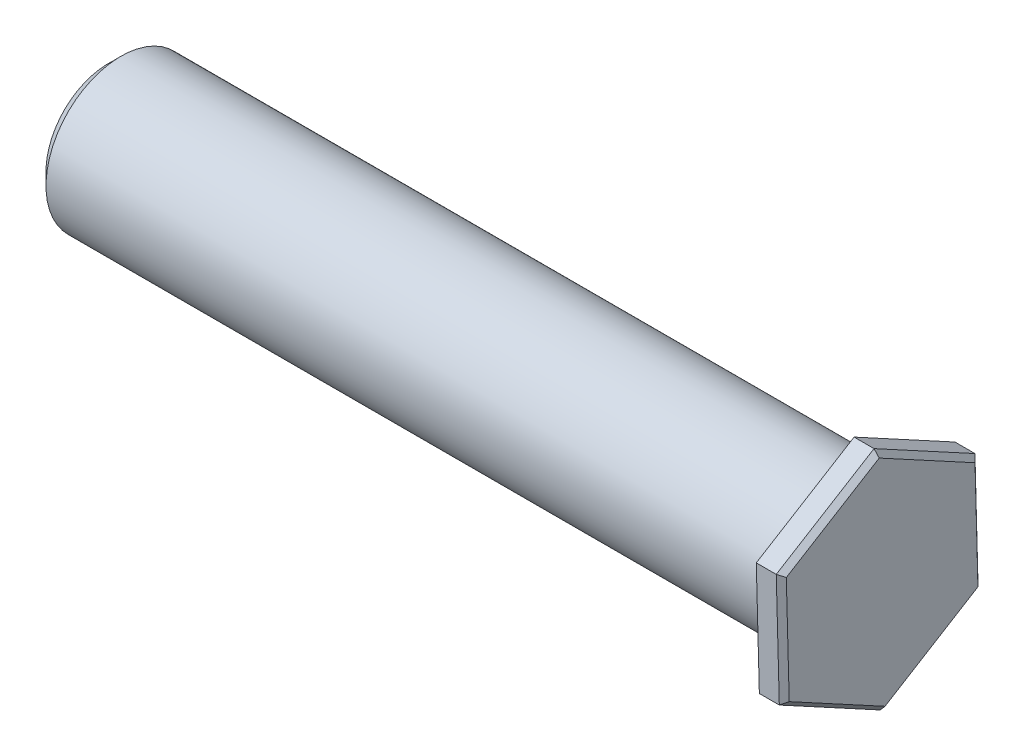
ISO-10303-21;
HEADER;
FILE_DESCRIPTION(('STEP AP214'),'2;1');
FILE_NAME('part.step','',(''),(''),'','','');
FILE_SCHEMA(('AUTOMOTIVE_DESIGN { 1 0 10303 214 1 1 1 1 }'));
ENDSEC;
DATA;
#1=APPLICATION_CONTEXT('core data for automotive mechanical design processes');
#2=APPLICATION_PROTOCOL_DEFINITION('international standard','automotive_design',2000,#1);
#3=PRODUCT_CONTEXT('',#1,'mechanical');
#4=PRODUCT('Part','Part','',(#3));
#5=PRODUCT_RELATED_PRODUCT_CATEGORY('part','',(#4));
#6=PRODUCT_DEFINITION_FORMATION('','',#4);
#7=PRODUCT_DEFINITION_CONTEXT('part definition',#1,'design');
#8=PRODUCT_DEFINITION('design','',#6,#7);
#9=PRODUCT_DEFINITION_SHAPE('','',#8);
#10=(LENGTH_UNIT() NAMED_UNIT(*) SI_UNIT(.MILLI.,.METRE.));
#11=(NAMED_UNIT(*) PLANE_ANGLE_UNIT() SI_UNIT($,.RADIAN.));
#12=(NAMED_UNIT(*) SI_UNIT($,.STERADIAN.) SOLID_ANGLE_UNIT());
#13=UNCERTAINTY_MEASURE_WITH_UNIT(LENGTH_MEASURE(1.E-05),#10,'distance_accuracy_value','');
#14=(GEOMETRIC_REPRESENTATION_CONTEXT(3) GLOBAL_UNCERTAINTY_ASSIGNED_CONTEXT((#13)) GLOBAL_UNIT_ASSIGNED_CONTEXT((#10,
#11,#12)) REPRESENTATION_CONTEXT('',''));
#15=CARTESIAN_POINT('',(0.,0.,0.));
#16=DIRECTION('',(0.,0.,1.));
#17=DIRECTION('',(1.,0.,0.));
#18=AXIS2_PLACEMENT_3D('',#15,#16,#17);
#19=CARTESIAN_POINT('',(150.,0.,0.));
#20=DIRECTION('',(-1.,0.,0.));
#21=DIRECTION('',(0.,0.,1.));
#22=AXIS2_PLACEMENT_3D('',#19,#20,#21);
#23=CYLINDRICAL_SURFACE('',#22,15.);
#24=CARTESIAN_POINT('',(2.5,0.,0.));
#25=DIRECTION('',(1.,0.,0.));
#26=DIRECTION('',(0.,0.,-1.));
#27=AXIS2_PLACEMENT_3D('',#24,#25,#26);
#28=CIRCLE('',#27,15.);
#29=CARTESIAN_POINT('',(2.5,0.,-15.));
#30=VERTEX_POINT('',#29);
#31=EDGE_CURVE('E45',#30,#30,#28,.T.);
#32=ORIENTED_EDGE('',*,*,#31,.T.);
#33=EDGE_LOOP('',(#32));
#34=FACE_BOUND('',#33,.T.);
#35=CARTESIAN_POINT('',(150.,0.,0.));
#36=DIRECTION('',(1.,0.,0.));
#37=DIRECTION('',(0.,0.,-1.));
#38=AXIS2_PLACEMENT_3D('',#35,#36,#37);
#39=CIRCLE('',#38,15.);
#40=CARTESIAN_POINT('',(150.,0.,-15.));
#41=VERTEX_POINT('',#40);
#42=EDGE_CURVE('E115',#41,#41,#39,.T.);
#43=ORIENTED_EDGE('',*,*,#42,.F.);
#44=EDGE_LOOP('',(#43));
#45=FACE_BOUND('',#44,.T.);
#46=ADVANCED_FACE('F37',(#34,#45),#23,.T.);
#47=CARTESIAN_POINT('',(0.,0.,0.));
#48=DIRECTION('',(1.,0.,0.));
#49=DIRECTION('',(0.,0.,-1.));
#50=AXIS2_PLACEMENT_3D('',#47,#48,#49);
#51=PLANE('',#50);
#52=CARTESIAN_POINT('',(0.,0.,0.));
#53=DIRECTION('',(1.,0.,0.));
#54=DIRECTION('',(0.,0.,-1.));
#55=AXIS2_PLACEMENT_3D('',#52,#53,#54);
#56=CIRCLE('',#55,12.5);
#57=CARTESIAN_POINT('',(0.,0.,-12.5));
#58=VERTEX_POINT('',#57);
#59=EDGE_CURVE('E11',#58,#58,#56,.F.);
#60=ORIENTED_EDGE('',*,*,#59,.T.);
#61=EDGE_LOOP('',(#60));
#62=FACE_BOUND('',#61,.T.);
#63=ADVANCED_FACE('F207',(#62),#51,.F.);
#64=CARTESIAN_POINT('',(155.,22.9804460287128,0.613778883586363));
#65=DIRECTION('',(0.,-0.852367064211171,-0.522943962435775));
#66=DIRECTION('',(0.,0.522943962435775,-0.852367064211171));
#67=AXIS2_PLACEMENT_3D('',#64,#65,#66);
#68=PLANE('',#67);
#69=DIRECTION('',(-1.,0.,0.));
#70=VECTOR('',#69,1.);
#71=CARTESIAN_POINT('',(155.,10.9586749088641,20.2085394929556));
#72=LINE('',#71,#70);
#73=CARTESIAN_POINT('',(154.,10.9586749088641,20.2085394929556));
#74=VERTEX_POINT('',#73);
#75=CARTESIAN_POINT('',(150.,10.9586749088641,20.2085394929556));
#76=VERTEX_POINT('',#75);
#77=EDGE_CURVE('E107',#74,#76,#72,.T.);
#78=ORIENTED_EDGE('',*,*,#77,.F.);
#79=DIRECTION('',(0.,0.522943962435775,-0.852367064211171));
#80=VECTOR('',#79,1.);
#81=CARTESIAN_POINT('',(154.,22.9804460287128,0.613778883586363));
#82=LINE('',#81,#80);
#83=CARTESIAN_POINT('',(154.,22.9804460287128,0.613778883586363));
#84=VERTEX_POINT('',#83);
#85=EDGE_CURVE('E178',#74,#84,#82,.T.);
#86=ORIENTED_EDGE('',*,*,#85,.T.);
#87=DIRECTION('',(-1.,0.,0.));
#88=VECTOR('',#87,1.);
#89=CARTESIAN_POINT('',(155.,22.9804460287128,0.613778883586363));
#90=LINE('',#89,#88);
#91=CARTESIAN_POINT('',(150.,22.9804460287128,0.613778883586363));
#92=VERTEX_POINT('',#91);
#93=EDGE_CURVE('E129',#84,#92,#90,.T.);
#94=ORIENTED_EDGE('',*,*,#93,.T.);
#95=DIRECTION('',(0.,-0.522943962435775,0.852367064211171));
#96=VECTOR('',#95,1.);
#97=CARTESIAN_POINT('',(150.,22.9804460287128,0.613778883586363));
#98=LINE('',#97,#96);
#99=EDGE_CURVE('E122',#92,#76,#98,.T.);
#100=ORIENTED_EDGE('',*,*,#99,.T.);
#101=EDGE_LOOP('',(#78,#86,#94,#100));
#102=FACE_BOUND('',#101,.T.);
#103=ADVANCED_FACE('F127',(#102),#68,.F.);
#104=CARTESIAN_POINT('',(155.,10.9586749088641,20.2085394929556));
#105=DIRECTION('',(0.,0.0266992241194905,-0.999643512173924));
#106=DIRECTION('',(0.,0.999643512173924,0.0266992241194905));
#107=AXIS2_PLACEMENT_3D('',#104,#105,#106);
#108=PLANE('',#107);
#109=DIRECTION('',(-1.,0.,0.));
#110=VECTOR('',#109,1.);
#111=CARTESIAN_POINT('',(155.,-12.0217711198486,19.5947606093693));
#112=LINE('',#111,#110);
#113=CARTESIAN_POINT('',(154.,-12.0217711198486,19.5947606093693));
#114=VERTEX_POINT('',#113);
#115=CARTESIAN_POINT('',(150.,-12.0217711198486,19.5947606093693));
#116=VERTEX_POINT('',#115);
#117=EDGE_CURVE('E116',#114,#116,#112,.T.);
#118=ORIENTED_EDGE('',*,*,#117,.F.);
#119=DIRECTION('',(0.,0.999643512173924,0.0266992241194905));
#120=VECTOR('',#119,1.);
#121=CARTESIAN_POINT('',(154.,10.9586749088641,20.2085394929556));
#122=LINE('',#121,#120);
#123=EDGE_CURVE('E52',#114,#74,#122,.T.);
#124=ORIENTED_EDGE('',*,*,#123,.T.);
#125=ORIENTED_EDGE('',*,*,#77,.T.);
#126=DIRECTION('',(0.,-0.999643512173924,-0.0266992241194905));
#127=VECTOR('',#126,1.);
#128=CARTESIAN_POINT('',(150.,10.9586749088641,20.2085394929556));
#129=LINE('',#128,#127);
#130=EDGE_CURVE('E110',#76,#116,#129,.T.);
#131=ORIENTED_EDGE('',*,*,#130,.T.);
#132=EDGE_LOOP('',(#118,#124,#125,#131));
#133=FACE_BOUND('',#132,.T.);
#134=ADVANCED_FACE('F109',(#133),#108,.F.);
#135=CARTESIAN_POINT('',(155.,-12.0217711198486,19.5947606093693));
#136=DIRECTION('',(0.,0.879066288330662,-0.476699549738149));
#137=DIRECTION('',(0.,0.476699549738149,0.879066288330662));
#138=AXIS2_PLACEMENT_3D('',#135,#136,#137);
#139=PLANE('',#138);
#140=DIRECTION('',(-1.,0.,0.));
#141=VECTOR('',#140,1.);
#142=CARTESIAN_POINT('',(155.,-22.9804460287128,-0.613778883586359));
#143=LINE('',#142,#141);
#144=CARTESIAN_POINT('',(154.,-22.9804460287128,-0.613778883586359));
#145=VERTEX_POINT('',#144);
#146=CARTESIAN_POINT('',(150.,-22.9804460287128,-0.613778883586359));
#147=VERTEX_POINT('',#146);
#148=EDGE_CURVE('E151',#145,#147,#143,.T.);
#149=ORIENTED_EDGE('',*,*,#148,.F.);
#150=DIRECTION('',(0.,0.476699549738149,0.879066288330662));
#151=VECTOR('',#150,1.);
#152=CARTESIAN_POINT('',(154.,-12.0217711198486,19.5947606093693));
#153=LINE('',#152,#151);
#154=EDGE_CURVE('E60',#145,#114,#153,.T.);
#155=ORIENTED_EDGE('',*,*,#154,.T.);
#156=ORIENTED_EDGE('',*,*,#117,.T.);
#157=DIRECTION('',(0.,-0.476699549738149,-0.879066288330662));
#158=VECTOR('',#157,1.);
#159=CARTESIAN_POINT('',(150.,-12.0217711198486,19.5947606093693));
#160=LINE('',#159,#158);
#161=EDGE_CURVE('E125',#116,#147,#160,.T.);
#162=ORIENTED_EDGE('',*,*,#161,.T.);
#163=EDGE_LOOP('',(#149,#155,#156,#162));
#164=FACE_BOUND('',#163,.T.);
#165=ADVANCED_FACE('F275',(#164),#139,.F.);
#166=CARTESIAN_POINT('',(155.,-22.9804460287128,-0.613778883586359));
#167=DIRECTION('',(0.,0.852367064211171,0.522943962435775));
#168=DIRECTION('',(0.,-0.522943962435775,0.852367064211171));
#169=AXIS2_PLACEMENT_3D('',#166,#167,#168);
#170=PLANE('',#169);
#171=DIRECTION('',(-1.,0.,0.));
#172=VECTOR('',#171,1.);
#173=CARTESIAN_POINT('',(155.,-10.9586749088641,-20.2085394929556));
#174=LINE('',#173,#172);
#175=CARTESIAN_POINT('',(154.,-10.9586749088641,-20.2085394929556));
#176=VERTEX_POINT('',#175);
#177=CARTESIAN_POINT('',(150.,-10.9586749088641,-20.2085394929556));
#178=VERTEX_POINT('',#177);
#179=EDGE_CURVE('E149',#176,#178,#174,.T.);
#180=ORIENTED_EDGE('',*,*,#179,.F.);
#181=DIRECTION('',(0.,-0.522943962435775,0.852367064211171));
#182=VECTOR('',#181,1.);
#183=CARTESIAN_POINT('',(154.,-22.9804460287128,-0.613778883586359));
#184=LINE('',#183,#182);
#185=EDGE_CURVE('E174',#176,#145,#184,.T.);
#186=ORIENTED_EDGE('',*,*,#185,.T.);
#187=ORIENTED_EDGE('',*,*,#148,.T.);
#188=DIRECTION('',(0.,0.522943962435775,-0.852367064211171));
#189=VECTOR('',#188,1.);
#190=CARTESIAN_POINT('',(150.,-22.9804460287128,-0.613778883586359));
#191=LINE('',#190,#189);
#192=EDGE_CURVE('E138',#147,#178,#191,.T.);
#193=ORIENTED_EDGE('',*,*,#192,.T.);
#194=EDGE_LOOP('',(#180,#186,#187,#193));
#195=FACE_BOUND('',#194,.T.);
#196=ADVANCED_FACE('F260',(#195),#170,.F.);
#197=CARTESIAN_POINT('',(155.,-10.9586749088641,-20.2085394929556));
#198=DIRECTION('',(0.,-0.0266992241194907,0.999643512173924));
#199=DIRECTION('',(0.,-0.999643512173924,-0.0266992241194907));
#200=AXIS2_PLACEMENT_3D('',#197,#198,#199);
#201=PLANE('',#200);
#202=DIRECTION('',(-1.,0.,0.));
#203=VECTOR('',#202,1.);
#204=CARTESIAN_POINT('',(155.,12.0217711198486,-19.5947606093693));
#205=LINE('',#204,#203);
#206=CARTESIAN_POINT('',(154.,12.0217711198486,-19.5947606093693));
#207=VERTEX_POINT('',#206);
#208=CARTESIAN_POINT('',(150.,12.0217711198486,-19.5947606093693));
#209=VERTEX_POINT('',#208);
#210=EDGE_CURVE('E147',#207,#209,#205,.T.);
#211=ORIENTED_EDGE('',*,*,#210,.F.);
#212=DIRECTION('',(0.,-0.999643512173924,-0.0266992241194907));
#213=VECTOR('',#212,1.);
#214=CARTESIAN_POINT('',(154.,-10.9586749088641,-20.2085394929556));
#215=LINE('',#214,#213);
#216=EDGE_CURVE('E172',#207,#176,#215,.T.);
#217=ORIENTED_EDGE('',*,*,#216,.T.);
#218=ORIENTED_EDGE('',*,*,#179,.T.);
#219=DIRECTION('',(0.,0.999643512173924,0.0266992241194907));
#220=VECTOR('',#219,1.);
#221=CARTESIAN_POINT('',(150.,-10.9586749088641,-20.2085394929556));
#222=LINE('',#221,#220);
#223=EDGE_CURVE('E141',#178,#209,#222,.T.);
#224=ORIENTED_EDGE('',*,*,#223,.T.);
#225=EDGE_LOOP('',(#211,#217,#218,#224));
#226=FACE_BOUND('',#225,.T.);
#227=ADVANCED_FACE('F257',(#226),#201,.F.);
#228=CARTESIAN_POINT('',(155.,12.0217711198486,-19.5947606093693));
#229=DIRECTION('',(0.,-0.879066288330662,0.476699549738149));
#230=DIRECTION('',(0.,-0.476699549738149,-0.879066288330662));
#231=AXIS2_PLACEMENT_3D('',#228,#229,#230);
#232=PLANE('',#231);
#233=ORIENTED_EDGE('',*,*,#93,.F.);
#234=DIRECTION('',(0.,-0.476699549738149,-0.879066288330662));
#235=VECTOR('',#234,1.);
#236=CARTESIAN_POINT('',(154.,12.0217711198486,-19.5947606093693));
#237=LINE('',#236,#235);
#238=EDGE_CURVE('E169',#84,#207,#237,.T.);
#239=ORIENTED_EDGE('',*,*,#238,.T.);
#240=ORIENTED_EDGE('',*,*,#210,.T.);
#241=DIRECTION('',(0.,0.476699549738149,0.879066288330662));
#242=VECTOR('',#241,1.);
#243=CARTESIAN_POINT('',(150.,12.0217711198486,-19.5947606093693));
#244=LINE('',#243,#242);
#245=EDGE_CURVE('E144',#209,#92,#244,.T.);
#246=ORIENTED_EDGE('',*,*,#245,.T.);
#247=EDGE_LOOP('',(#233,#239,#240,#246));
#248=FACE_BOUND('',#247,.T.);
#249=ADVANCED_FACE('F248',(#248),#232,.F.);
#250=CARTESIAN_POINT('',(155.,0.,0.));
#251=DIRECTION('',(1.,0.,0.));
#252=DIRECTION('',(0.,0.,-1.));
#253=AXIS2_PLACEMENT_3D('',#250,#251,#252);
#254=PLANE('',#253);
#255=DIRECTION('',(0.,0.999643512173924,0.0266992241194907));
#256=VECTOR('',#255,1.);
#257=CARTESIAN_POINT('',(155.,11.9950718957291,-18.5951170971953));
#258=LINE('',#257,#256);
#259=CARTESIAN_POINT('',(155.,-10.4082296821363,-19.1934811765491));
#260=VERTEX_POINT('',#259);
#261=CARTESIAN_POINT('',(155.,11.4179274448818,-18.6105319014279));
#262=VERTEX_POINT('',#261);
#263=EDGE_CURVE('E164',#260,#262,#258,.T.);
#264=ORIENTED_EDGE('',*,*,#263,.T.);
#265=DIRECTION('',(0.,0.476699549738149,0.879066288330662));
#266=VECTOR('',#265,1.);
#267=CARTESIAN_POINT('',(155.,22.1013797403821,1.09047843332452));
#268=LINE('',#267,#266);
#269=CARTESIAN_POINT('',(155.,21.8261571270182,0.582949275121277));
#270=VERTEX_POINT('',#269);
#271=EDGE_CURVE('E166',#262,#270,#268,.T.);
#272=ORIENTED_EDGE('',*,*,#271,.T.);
#273=DIRECTION('',(0.,-0.522943962435775,0.852367064211171));
#274=VECTOR('',#273,1.);
#275=CARTESIAN_POINT('',(155.,10.1063078446529,19.6855955305199));
#276=LINE('',#275,#274);
#277=CARTESIAN_POINT('',(155.,10.4082296821363,19.1934811765491));
#278=VERTEX_POINT('',#277);
#279=EDGE_CURVE('E156',#270,#278,#276,.T.);
#280=ORIENTED_EDGE('',*,*,#279,.T.);
#281=DIRECTION('',(0.,-0.999643512173924,-0.0266992241194905));
#282=VECTOR('',#281,1.);
#283=CARTESIAN_POINT('',(155.,-11.9950718957291,18.5951170971953));
#284=LINE('',#283,#282);
#285=CARTESIAN_POINT('',(155.,-11.4179274448818,18.6105319014279));
#286=VERTEX_POINT('',#285);
#287=EDGE_CURVE('E158',#278,#286,#284,.T.);
#288=ORIENTED_EDGE('',*,*,#287,.T.);
#289=DIRECTION('',(0.,-0.476699549738149,-0.879066288330662));
#290=VECTOR('',#289,1.);
#291=CARTESIAN_POINT('',(155.,-22.1013797403821,-1.09047843332452));
#292=LINE('',#291,#290);
#293=CARTESIAN_POINT('',(155.,-21.8261571270182,-0.582949275121274));
#294=VERTEX_POINT('',#293);
#295=EDGE_CURVE('E160',#286,#294,#292,.T.);
#296=ORIENTED_EDGE('',*,*,#295,.T.);
#297=DIRECTION('',(0.,0.522943962435775,-0.852367064211171));
#298=VECTOR('',#297,1.);
#299=CARTESIAN_POINT('',(155.,-10.1063078446529,-19.6855955305199));
#300=LINE('',#299,#298);
#301=EDGE_CURVE('E162',#294,#260,#300,.T.);
#302=ORIENTED_EDGE('',*,*,#301,.T.);
#303=EDGE_LOOP('',(#264,#272,#280,#288,#296,#302));
#304=FACE_BOUND('',#303,.T.);
#305=ADVANCED_FACE('F236',(#304),#254,.T.);
#306=CARTESIAN_POINT('',(150.,0.,0.));
#307=DIRECTION('',(1.,0.,0.));
#308=DIRECTION('',(0.,0.,-1.));
#309=AXIS2_PLACEMENT_3D('',#306,#307,#308);
#310=PLANE('',#309);
#311=ORIENTED_EDGE('',*,*,#42,.T.);
#312=EDGE_LOOP('',(#311));
#313=FACE_BOUND('',#312,.T.);
#314=ORIENTED_EDGE('',*,*,#99,.F.);
#315=ORIENTED_EDGE('',*,*,#245,.F.);
#316=ORIENTED_EDGE('',*,*,#223,.F.);
#317=ORIENTED_EDGE('',*,*,#192,.F.);
#318=ORIENTED_EDGE('',*,*,#161,.F.);
#319=ORIENTED_EDGE('',*,*,#130,.F.);
#320=EDGE_LOOP('',(#314,#315,#316,#317,#318,#319));
#321=FACE_BOUND('',#320,.T.);
#322=ADVANCED_FACE('F120',(#313,#321),#310,.F.);
#323=CARTESIAN_POINT('',(155.,-16.62204228595,9.0137913131533));
#324=DIRECTION('',(0.707106781186548,-0.621593733591099,0.337077484208419));
#325=DIRECTION('',(0.,0.476699549738149,0.879066288330662));
#326=AXIS2_PLACEMENT_3D('',#323,#324,#325);
#327=PLANE('',#326);
#328=DIRECTION('',(0.654653670707976,0.39530847835079,-0.644328936469995));
#329=VECTOR('',#328,1.);
#330=CARTESIAN_POINT('',(157.701249611028,-9.78679495275585,15.9518844869382));
#331=LINE('',#330,#329);
#332=EDGE_CURVE('E134',#114,#286,#331,.T.);
#333=ORIENTED_EDGE('',*,*,#332,.F.);
#334=ORIENTED_EDGE('',*,*,#154,.F.);
#335=DIRECTION('',(0.654653670707977,0.755659466551821,0.0201827163481556));
#336=VECTOR('',#335,1.);
#337=CARTESIAN_POINT('',(157.701249611028,-18.7081346803013,-0.499670807246813));
#338=LINE('',#337,#336);
#339=EDGE_CURVE('E131',#294,#145,#338,.F.);
#340=ORIENTED_EDGE('',*,*,#339,.F.);
#341=ORIENTED_EDGE('',*,*,#295,.F.);
#342=EDGE_LOOP('',(#333,#334,#340,#341));
#343=FACE_BOUND('',#342,.T.);
#344=ADVANCED_FACE('F229',(#343),#327,.T.);
#345=CARTESIAN_POINT('',(155.,-16.1171934045773,-9.88821522583521));
#346=DIRECTION('',(0.707106781186548,-0.602714531163788,-0.369777222018899));
#347=DIRECTION('',(0.,-0.522943962435775,0.852367064211171));
#348=AXIS2_PLACEMENT_3D('',#345,#346,#347);
#349=PLANE('',#348);
#350=ORIENTED_EDGE('',*,*,#339,.T.);
#351=ORIENTED_EDGE('',*,*,#185,.F.);
#352=DIRECTION('',(0.654653670707977,0.360350988201031,0.664511652818152));
#353=VECTOR('',#352,1.);
#354=CARTESIAN_POINT('',(157.701249611028,-8.92133972754543,-16.451555294185));
#355=LINE('',#354,#353);
#356=EDGE_CURVE('E187',#260,#176,#355,.F.);
#357=ORIENTED_EDGE('',*,*,#356,.F.);
#358=ORIENTED_EDGE('',*,*,#301,.F.);
#359=EDGE_LOOP('',(#350,#351,#357,#358));
#360=FACE_BOUND('',#359,.T.);
#361=ADVANCED_FACE('F226',(#360),#349,.T.);
#362=CARTESIAN_POINT('',(155.,-0.504848881372747,18.9020065389885));
#363=DIRECTION('',(0.707106781186548,-0.0188792024273112,0.706854706227318));
#364=DIRECTION('',(0.,0.999643512173924,0.0266992241194905));
#365=AXIS2_PLACEMENT_3D('',#362,#363,#364);
#366=PLANE('',#365);
#367=ORIENTED_EDGE('',*,*,#332,.T.);
#368=ORIENTED_EDGE('',*,*,#287,.F.);
#369=DIRECTION('',(0.654653670707977,-0.36035098820103,-0.664511652818153));
#370=VECTOR('',#369,1.);
#371=CARTESIAN_POINT('',(157.701249611028,8.92133972754543,16.451555294185));
#372=LINE('',#371,#370);
#373=EDGE_CURVE('E184',#74,#278,#372,.T.);
#374=ORIENTED_EDGE('',*,*,#373,.F.);
#375=ORIENTED_EDGE('',*,*,#123,.F.);
#376=EDGE_LOOP('',(#367,#368,#374,#375));
#377=FACE_BOUND('',#376,.T.);
#378=ADVANCED_FACE('F222',(#377),#366,.T.);
#379=CARTESIAN_POINT('',(155.,0.50484888137275,-18.9020065389885));
#380=DIRECTION('',(0.707106781186548,0.0188792024273113,-0.706854706227318));
#381=DIRECTION('',(0.,-0.999643512173924,-0.0266992241194907));
#382=AXIS2_PLACEMENT_3D('',#379,#380,#381);
#383=PLANE('',#382);
#384=ORIENTED_EDGE('',*,*,#356,.T.);
#385=ORIENTED_EDGE('',*,*,#216,.F.);
#386=DIRECTION('',(0.654653670707977,-0.39530847835079,0.644328936469995));
#387=VECTOR('',#386,1.);
#388=CARTESIAN_POINT('',(157.701249611028,9.78679495275585,-15.9518844869382));
#389=LINE('',#388,#387);
#390=EDGE_CURVE('E182',#262,#207,#389,.F.);
#391=ORIENTED_EDGE('',*,*,#390,.F.);
#392=ORIENTED_EDGE('',*,*,#263,.F.);
#393=EDGE_LOOP('',(#384,#385,#391,#392));
#394=FACE_BOUND('',#393,.T.);
#395=ADVANCED_FACE('F218',(#394),#383,.T.);
#396=CARTESIAN_POINT('',(155.,16.1171934045773,9.88821522583521));
#397=DIRECTION('',(0.707106781186548,0.602714531163789,0.3697772220189));
#398=DIRECTION('',(0.,0.522943962435775,-0.852367064211171));
#399=AXIS2_PLACEMENT_3D('',#396,#397,#398);
#400=PLANE('',#399);
#401=ORIENTED_EDGE('',*,*,#373,.T.);
#402=ORIENTED_EDGE('',*,*,#279,.F.);
#403=DIRECTION('',(-0.654653670707977,0.75565946655182,0.0201827163481566));
#404=VECTOR('',#403,1.);
#405=CARTESIAN_POINT('',(157.701249611028,18.7081346803013,0.499670807246813));
#406=LINE('',#405,#404);
#407=EDGE_CURVE('E180',#84,#270,#406,.F.);
#408=ORIENTED_EDGE('',*,*,#407,.F.);
#409=ORIENTED_EDGE('',*,*,#85,.F.);
#410=EDGE_LOOP('',(#401,#402,#408,#409));
#411=FACE_BOUND('',#410,.T.);
#412=ADVANCED_FACE('F202',(#411),#400,.T.);
#413=CARTESIAN_POINT('',(155.,16.62204228595,-9.01379131315329));
#414=DIRECTION('',(0.707106781186548,0.6215937335911,-0.337077484208419));
#415=DIRECTION('',(0.,-0.476699549738149,-0.879066288330662));
#416=AXIS2_PLACEMENT_3D('',#413,#414,#415);
#417=PLANE('',#416);
#418=ORIENTED_EDGE('',*,*,#390,.T.);
#419=ORIENTED_EDGE('',*,*,#238,.F.);
#420=ORIENTED_EDGE('',*,*,#407,.T.);
#421=ORIENTED_EDGE('',*,*,#271,.F.);
#422=EDGE_LOOP('',(#418,#419,#420,#421));
#423=FACE_BOUND('',#422,.T.);
#424=ADVANCED_FACE('F197',(#423),#417,.T.);
#425=CARTESIAN_POINT('',(2.5,0.,0.));
#426=DIRECTION('',(1.,0.,0.));
#427=DIRECTION('',(0.,0.,-1.));
#428=AXIS2_PLACEMENT_3D('',#425,#426,#427);
#429=CONICAL_SURFACE('',#428,15.,0.785398163397448);
#430=ORIENTED_EDGE('',*,*,#59,.F.);
#431=EDGE_LOOP('',(#430));
#432=FACE_BOUND('',#431,.T.);
#433=ORIENTED_EDGE('',*,*,#31,.F.);
#434=EDGE_LOOP('',(#433));
#435=FACE_BOUND('',#434,.T.);
#436=ADVANCED_FACE('F39',(#432,#435),#429,.T.);
#437=CLOSED_SHELL('',(#46,#63,#103,#134,#165,#196,#227,#249,#305,#322,#344,#361,#378,#395,#412,
#424,#436));
#438=MANIFOLD_SOLID_BREP('B2',#437);
#439=ADVANCED_BREP_SHAPE_REPRESENTATION('',(#18,#438),#14);
#440=SHAPE_DEFINITION_REPRESENTATION(#9,#439);
ENDSEC;
END-ISO-10303-21;
